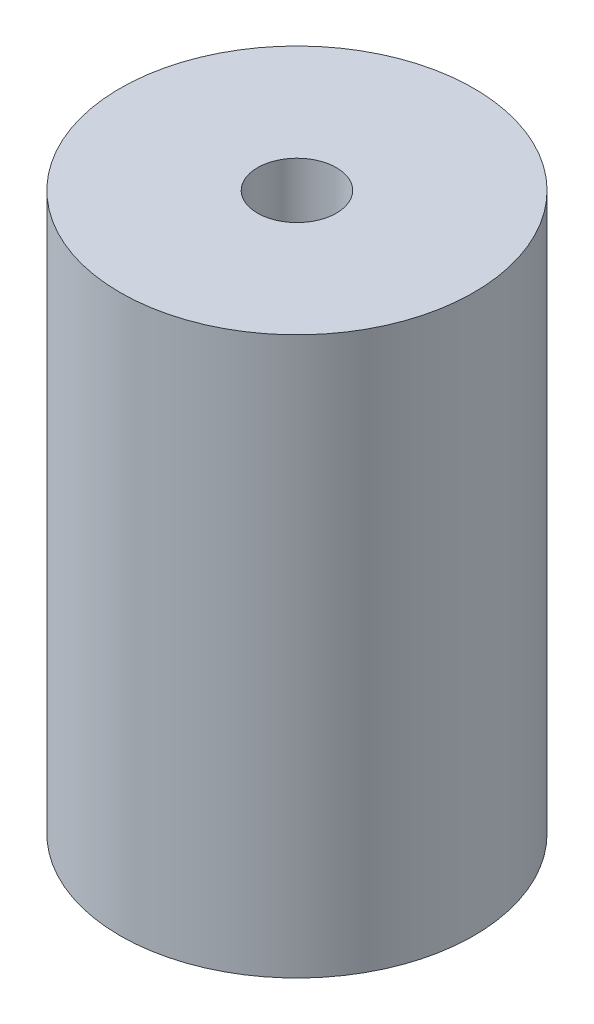
ISO-10303-21;
HEADER;
FILE_DESCRIPTION(('STEP AP214'),'2;1');
FILE_NAME('part.step','',(''),(''),'','','');
FILE_SCHEMA(('AUTOMOTIVE_DESIGN { 1 0 10303 214 1 1 1 1 }'));
ENDSEC;
DATA;
#1=APPLICATION_CONTEXT('core data for automotive mechanical design processes');
#2=APPLICATION_PROTOCOL_DEFINITION('international standard','automotive_design',2000,#1);
#3=PRODUCT_CONTEXT('',#1,'mechanical');
#4=PRODUCT('Part','Part','',(#3));
#5=PRODUCT_RELATED_PRODUCT_CATEGORY('part','',(#4));
#6=PRODUCT_DEFINITION_FORMATION('','',#4);
#7=PRODUCT_DEFINITION_CONTEXT('part definition',#1,'design');
#8=PRODUCT_DEFINITION('design','',#6,#7);
#9=PRODUCT_DEFINITION_SHAPE('','',#8);
#10=(LENGTH_UNIT() NAMED_UNIT(*) SI_UNIT(.MILLI.,.METRE.));
#11=(NAMED_UNIT(*) PLANE_ANGLE_UNIT() SI_UNIT($,.RADIAN.));
#12=(NAMED_UNIT(*) SI_UNIT($,.STERADIAN.) SOLID_ANGLE_UNIT());
#13=UNCERTAINTY_MEASURE_WITH_UNIT(LENGTH_MEASURE(1.E-05),#10,'distance_accuracy_value','');
#14=(GEOMETRIC_REPRESENTATION_CONTEXT(3) GLOBAL_UNCERTAINTY_ASSIGNED_CONTEXT((#13)) GLOBAL_UNIT_ASSIGNED_CONTEXT((#10,
#11,#12)) REPRESENTATION_CONTEXT('',''));
#15=CARTESIAN_POINT('',(0.,0.,0.));
#16=DIRECTION('',(0.,0.,1.));
#17=DIRECTION('',(1.,0.,0.));
#18=AXIS2_PLACEMENT_3D('',#15,#16,#17);
#19=CARTESIAN_POINT('',(0.,60.,0.));
#20=DIRECTION('',(0.,-1.,0.));
#21=DIRECTION('',(0.,0.,-1.));
#22=AXIS2_PLACEMENT_3D('',#19,#20,#21);
#23=CYLINDRICAL_SURFACE('',#22,19.05);
#24=CARTESIAN_POINT('',(0.,60.,0.));
#25=DIRECTION('',(0.,1.,0.));
#26=DIRECTION('',(0.,0.,1.));
#27=AXIS2_PLACEMENT_3D('',#24,#25,#26);
#28=CIRCLE('',#27,19.05);
#29=CARTESIAN_POINT('',(0.,60.,19.05));
#30=VERTEX_POINT('',#29);
#31=EDGE_CURVE('E11',#30,#30,#28,.T.);
#32=ORIENTED_EDGE('',*,*,#31,.F.);
#33=EDGE_LOOP('',(#32));
#34=FACE_BOUND('',#33,.T.);
#35=CARTESIAN_POINT('',(0.,0.,0.));
#36=DIRECTION('',(0.,1.,0.));
#37=DIRECTION('',(0.,0.,1.));
#38=AXIS2_PLACEMENT_3D('',#35,#36,#37);
#39=CIRCLE('',#38,19.05);
#40=CARTESIAN_POINT('',(0.,0.,19.05));
#41=VERTEX_POINT('',#40);
#42=EDGE_CURVE('E20',#41,#41,#39,.T.);
#43=ORIENTED_EDGE('',*,*,#42,.T.);
#44=EDGE_LOOP('',(#43));
#45=FACE_BOUND('',#44,.T.);
#46=ADVANCED_FACE('F17',(#34,#45),#23,.T.);
#47=CARTESIAN_POINT('',(0.,60.,0.));
#48=DIRECTION('',(0.,1.,0.));
#49=DIRECTION('',(0.,0.,1.));
#50=AXIS2_PLACEMENT_3D('',#47,#48,#49);
#51=PLANE('',#50);
#52=CARTESIAN_POINT('',(0.,60.,0.));
#53=DIRECTION('',(0.,1.,0.));
#54=DIRECTION('',(0.,0.,1.));
#55=AXIS2_PLACEMENT_3D('',#52,#53,#54);
#56=CIRCLE('',#55,4.25);
#57=CARTESIAN_POINT('',(0.,60.,4.25));
#58=VERTEX_POINT('',#57);
#59=EDGE_CURVE('E51',#58,#58,#56,.T.);
#60=ORIENTED_EDGE('',*,*,#59,.F.);
#61=EDGE_LOOP('',(#60));
#62=FACE_BOUND('',#61,.T.);
#63=ORIENTED_EDGE('',*,*,#31,.T.);
#64=EDGE_LOOP('',(#63));
#65=FACE_BOUND('',#64,.T.);
#66=ADVANCED_FACE('F87',(#62,#65),#51,.T.);
#67=CARTESIAN_POINT('',(0.,0.,0.));
#68=DIRECTION('',(0.,1.,0.));
#69=DIRECTION('',(0.,0.,1.));
#70=AXIS2_PLACEMENT_3D('',#67,#68,#69);
#71=PLANE('',#70);
#72=CARTESIAN_POINT('',(10.,0.,-10.));
#73=DIRECTION('',(0.,-1.,0.));
#74=DIRECTION('',(0.,0.,-1.));
#75=AXIS2_PLACEMENT_3D('',#72,#73,#74);
#76=CIRCLE('',#75,1.65);
#77=CARTESIAN_POINT('',(10.,0.,-11.65));
#78=VERTEX_POINT('',#77);
#79=EDGE_CURVE('E50',#78,#78,#76,.T.);
#80=ORIENTED_EDGE('',*,*,#79,.F.);
#81=EDGE_LOOP('',(#80));
#82=FACE_BOUND('',#81,.T.);
#83=CARTESIAN_POINT('',(-10.,0.,10.));
#84=DIRECTION('',(0.,-1.,0.));
#85=DIRECTION('',(0.,0.,-1.));
#86=AXIS2_PLACEMENT_3D('',#83,#84,#85);
#87=CIRCLE('',#86,1.65);
#88=CARTESIAN_POINT('',(-10.,0.,8.35));
#89=VERTEX_POINT('',#88);
#90=EDGE_CURVE('E61',#89,#89,#87,.T.);
#91=ORIENTED_EDGE('',*,*,#90,.F.);
#92=EDGE_LOOP('',(#91));
#93=FACE_BOUND('',#92,.T.);
#94=CARTESIAN_POINT('',(-10.,0.,-10.));
#95=DIRECTION('',(0.,-1.,0.));
#96=DIRECTION('',(0.,0.,-1.));
#97=AXIS2_PLACEMENT_3D('',#94,#95,#96);
#98=CIRCLE('',#97,1.65);
#99=CARTESIAN_POINT('',(-10.,0.,-11.65));
#100=VERTEX_POINT('',#99);
#101=EDGE_CURVE('E67',#100,#100,#98,.T.);
#102=ORIENTED_EDGE('',*,*,#101,.F.);
#103=EDGE_LOOP('',(#102));
#104=FACE_BOUND('',#103,.T.);
#105=CARTESIAN_POINT('',(10.,0.,10.));
#106=DIRECTION('',(0.,-1.,0.));
#107=DIRECTION('',(0.,0.,-1.));
#108=AXIS2_PLACEMENT_3D('',#105,#106,#107);
#109=CIRCLE('',#108,1.65);
#110=CARTESIAN_POINT('',(10.,0.,8.35));
#111=VERTEX_POINT('',#110);
#112=EDGE_CURVE('E73',#111,#111,#109,.T.);
#113=ORIENTED_EDGE('',*,*,#112,.F.);
#114=EDGE_LOOP('',(#113));
#115=FACE_BOUND('',#114,.T.);
#116=ORIENTED_EDGE('',*,*,#42,.F.);
#117=EDGE_LOOP('',(#116));
#118=FACE_BOUND('',#117,.T.);
#119=ADVANCED_FACE('F84',(#82,#93,#104,#115,#118),#71,.F.);
#120=CARTESIAN_POINT('',(10.,10.1,10.));
#121=DIRECTION('',(0.,-1.,0.));
#122=DIRECTION('',(0.,0.,-1.));
#123=AXIS2_PLACEMENT_3D('',#120,#121,#122);
#124=CONICAL_SURFACE('',#123,1.65,1.02974425867665);
#125=CARTESIAN_POINT('',(10.,11.0914200213955,10.));
#126=VERTEX_POINT('',#125);
#127=VERTEX_LOOP('',#126);
#128=FACE_BOUND('',#127,.T.);
#129=CARTESIAN_POINT('',(10.,10.1,10.));
#130=DIRECTION('',(0.,-1.,0.));
#131=DIRECTION('',(0.,0.,-1.));
#132=AXIS2_PLACEMENT_3D('',#129,#130,#131);
#133=CIRCLE('',#132,1.65);
#134=CARTESIAN_POINT('',(10.,10.1,8.35));
#135=VERTEX_POINT('',#134);
#136=EDGE_CURVE('E76',#135,#135,#133,.T.);
#137=ORIENTED_EDGE('',*,*,#136,.T.);
#138=EDGE_LOOP('',(#137));
#139=FACE_BOUND('',#138,.T.);
#140=ADVANCED_FACE('F86',(#128,#139),#124,.F.);
#141=CARTESIAN_POINT('',(10.,0.,10.));
#142=DIRECTION('',(0.,-1.,0.));
#143=DIRECTION('',(0.,0.,-1.));
#144=AXIS2_PLACEMENT_3D('',#141,#142,#143);
#145=CYLINDRICAL_SURFACE('',#144,1.65);
#146=ORIENTED_EDGE('',*,*,#136,.F.);
#147=EDGE_LOOP('',(#146));
#148=FACE_BOUND('',#147,.T.);
#149=ORIENTED_EDGE('',*,*,#112,.T.);
#150=EDGE_LOOP('',(#149));
#151=FACE_BOUND('',#150,.T.);
#152=ADVANCED_FACE('F95',(#148,#151),#145,.F.);
#153=CARTESIAN_POINT('',(-10.,10.1,-10.));
#154=DIRECTION('',(0.,-1.,0.));
#155=DIRECTION('',(0.,0.,-1.));
#156=AXIS2_PLACEMENT_3D('',#153,#154,#155);
#157=CONICAL_SURFACE('',#156,1.65,1.02974425867665);
#158=CARTESIAN_POINT('',(-10.,11.0914200213955,-10.));
#159=VERTEX_POINT('',#158);
#160=VERTEX_LOOP('',#159);
#161=FACE_BOUND('',#160,.T.);
#162=CARTESIAN_POINT('',(-10.,10.1,-10.));
#163=DIRECTION('',(0.,-1.,0.));
#164=DIRECTION('',(0.,0.,-1.));
#165=AXIS2_PLACEMENT_3D('',#162,#163,#164);
#166=CIRCLE('',#165,1.65);
#167=CARTESIAN_POINT('',(-10.,10.1,-11.65));
#168=VERTEX_POINT('',#167);
#169=EDGE_CURVE('E70',#168,#168,#166,.T.);
#170=ORIENTED_EDGE('',*,*,#169,.T.);
#171=EDGE_LOOP('',(#170));
#172=FACE_BOUND('',#171,.T.);
#173=ADVANCED_FACE('F185',(#161,#172),#157,.F.);
#174=CARTESIAN_POINT('',(-10.,0.,-10.));
#175=DIRECTION('',(0.,-1.,0.));
#176=DIRECTION('',(0.,0.,-1.));
#177=AXIS2_PLACEMENT_3D('',#174,#175,#176);
#178=CYLINDRICAL_SURFACE('',#177,1.65);
#179=ORIENTED_EDGE('',*,*,#169,.F.);
#180=EDGE_LOOP('',(#179));
#181=FACE_BOUND('',#180,.T.);
#182=ORIENTED_EDGE('',*,*,#101,.T.);
#183=EDGE_LOOP('',(#182));
#184=FACE_BOUND('',#183,.T.);
#185=ADVANCED_FACE('F181',(#181,#184),#178,.F.);
#186=CARTESIAN_POINT('',(-10.,10.1,10.));
#187=DIRECTION('',(0.,-1.,0.));
#188=DIRECTION('',(0.,0.,-1.));
#189=AXIS2_PLACEMENT_3D('',#186,#187,#188);
#190=CONICAL_SURFACE('',#189,1.65,1.02974425867665);
#191=CARTESIAN_POINT('',(-10.,11.0914200213955,10.));
#192=VERTEX_POINT('',#191);
#193=VERTEX_LOOP('',#192);
#194=FACE_BOUND('',#193,.T.);
#195=CARTESIAN_POINT('',(-10.,10.1,10.));
#196=DIRECTION('',(0.,-1.,0.));
#197=DIRECTION('',(0.,0.,-1.));
#198=AXIS2_PLACEMENT_3D('',#195,#196,#197);
#199=CIRCLE('',#198,1.65);
#200=CARTESIAN_POINT('',(-10.,10.1,8.35));
#201=VERTEX_POINT('',#200);
#202=EDGE_CURVE('E64',#201,#201,#199,.T.);
#203=ORIENTED_EDGE('',*,*,#202,.T.);
#204=EDGE_LOOP('',(#203));
#205=FACE_BOUND('',#204,.T.);
#206=ADVANCED_FACE('F172',(#194,#205),#190,.F.);
#207=CARTESIAN_POINT('',(-10.,0.,10.));
#208=DIRECTION('',(0.,-1.,0.));
#209=DIRECTION('',(0.,0.,-1.));
#210=AXIS2_PLACEMENT_3D('',#207,#208,#209);
#211=CYLINDRICAL_SURFACE('',#210,1.65);
#212=ORIENTED_EDGE('',*,*,#202,.F.);
#213=EDGE_LOOP('',(#212));
#214=FACE_BOUND('',#213,.T.);
#215=ORIENTED_EDGE('',*,*,#90,.T.);
#216=EDGE_LOOP('',(#215));
#217=FACE_BOUND('',#216,.T.);
#218=ADVANCED_FACE('F168',(#214,#217),#211,.F.);
#219=CARTESIAN_POINT('',(10.,10.1,-10.));
#220=DIRECTION('',(0.,-1.,0.));
#221=DIRECTION('',(0.,0.,-1.));
#222=AXIS2_PLACEMENT_3D('',#219,#220,#221);
#223=CONICAL_SURFACE('',#222,1.65,1.02974425867665);
#224=CARTESIAN_POINT('',(10.,11.0914200213955,-10.));
#225=VERTEX_POINT('',#224);
#226=VERTEX_LOOP('',#225);
#227=FACE_BOUND('',#226,.T.);
#228=CARTESIAN_POINT('',(10.,10.1,-10.));
#229=DIRECTION('',(0.,-1.,0.));
#230=DIRECTION('',(0.,0.,-1.));
#231=AXIS2_PLACEMENT_3D('',#228,#229,#230);
#232=CIRCLE('',#231,1.65);
#233=CARTESIAN_POINT('',(10.,10.1,-11.65));
#234=VERTEX_POINT('',#233);
#235=EDGE_CURVE('E54',#234,#234,#232,.T.);
#236=ORIENTED_EDGE('',*,*,#235,.T.);
#237=EDGE_LOOP('',(#236));
#238=FACE_BOUND('',#237,.T.);
#239=ADVANCED_FACE('F158',(#227,#238),#223,.F.);
#240=CARTESIAN_POINT('',(10.,0.,-10.));
#241=DIRECTION('',(0.,-1.,0.));
#242=DIRECTION('',(0.,0.,-1.));
#243=AXIS2_PLACEMENT_3D('',#240,#241,#242);
#244=CYLINDRICAL_SURFACE('',#243,1.65);
#245=ORIENTED_EDGE('',*,*,#235,.F.);
#246=EDGE_LOOP('',(#245));
#247=FACE_BOUND('',#246,.T.);
#248=ORIENTED_EDGE('',*,*,#79,.T.);
#249=EDGE_LOOP('',(#248));
#250=FACE_BOUND('',#249,.T.);
#251=ADVANCED_FACE('F44',(#247,#250),#244,.F.);
#252=CARTESIAN_POINT('',(0.,35.5,0.));
#253=DIRECTION('',(0.,1.,0.));
#254=DIRECTION('',(0.,0.,1.));
#255=AXIS2_PLACEMENT_3D('',#252,#253,#254);
#256=CONICAL_SURFACE('',#255,4.25,1.02974425867665);
#257=CARTESIAN_POINT('',(0.,32.9463423691329,0.));
#258=VERTEX_POINT('',#257);
#259=VERTEX_LOOP('',#258);
#260=FACE_BOUND('',#259,.T.);
#261=CARTESIAN_POINT('',(0.,35.5,0.));
#262=DIRECTION('',(0.,1.,0.));
#263=DIRECTION('',(0.,0.,1.));
#264=AXIS2_PLACEMENT_3D('',#261,#262,#263);
#265=CIRCLE('',#264,4.25);
#266=CARTESIAN_POINT('',(0.,35.5,4.25));
#267=VERTEX_POINT('',#266);
#268=EDGE_CURVE('E48',#267,#267,#265,.T.);
#269=ORIENTED_EDGE('',*,*,#268,.T.);
#270=EDGE_LOOP('',(#269));
#271=FACE_BOUND('',#270,.T.);
#272=ADVANCED_FACE('F40',(#260,#271),#256,.F.);
#273=CARTESIAN_POINT('',(0.,60.,0.));
#274=DIRECTION('',(0.,1.,0.));
#275=DIRECTION('',(0.,0.,1.));
#276=AXIS2_PLACEMENT_3D('',#273,#274,#275);
#277=CYLINDRICAL_SURFACE('',#276,4.25);
#278=ORIENTED_EDGE('',*,*,#268,.F.);
#279=EDGE_LOOP('',(#278));
#280=FACE_BOUND('',#279,.T.);
#281=ORIENTED_EDGE('',*,*,#59,.T.);
#282=EDGE_LOOP('',(#281));
#283=FACE_BOUND('',#282,.T.);
#284=ADVANCED_FACE('F43',(#280,#283),#277,.F.);
#285=CLOSED_SHELL('',(#46,#66,#119,#140,#152,#173,#185,#206,#218,#239,#251,#272,#284));
#286=MANIFOLD_SOLID_BREP('B1',#285);
#287=ADVANCED_BREP_SHAPE_REPRESENTATION('',(#18,#286),#14);
#288=SHAPE_DEFINITION_REPRESENTATION(#9,#287);
ENDSEC;
END-ISO-10303-21;
